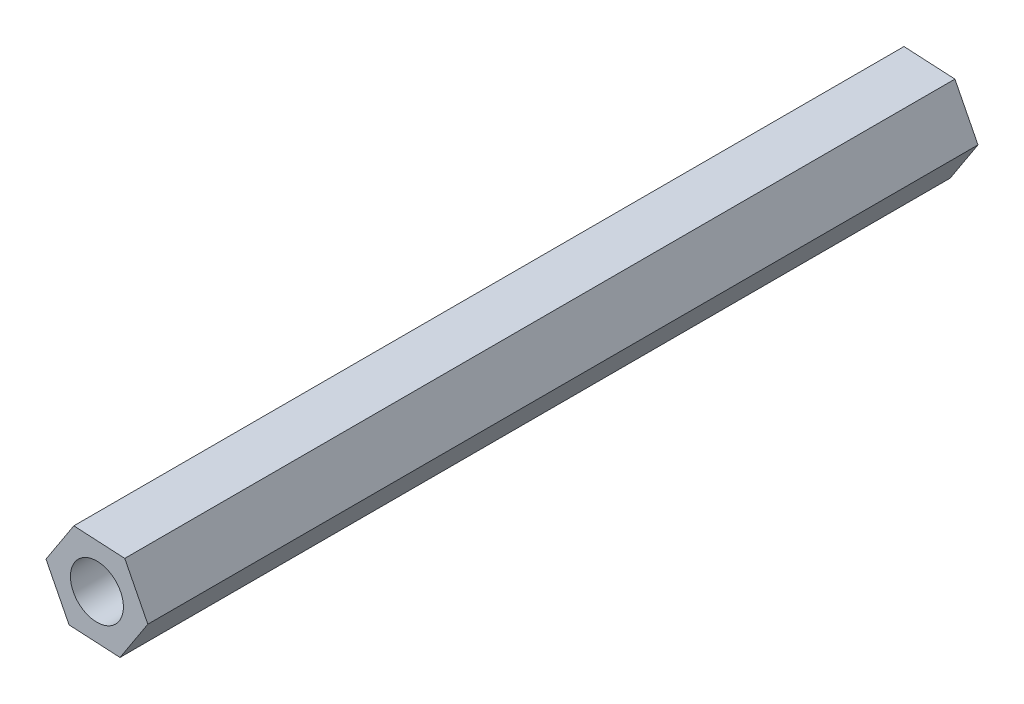
ISO-10303-21;
HEADER;
FILE_DESCRIPTION(('STEP AP214'),'2;1');
FILE_NAME('part.step','',(''),(''),'','','');
FILE_SCHEMA(('AUTOMOTIVE_DESIGN { 1 0 10303 214 1 1 1 1 }'));
ENDSEC;
DATA;
#1=APPLICATION_CONTEXT('core data for automotive mechanical design processes');
#2=APPLICATION_PROTOCOL_DEFINITION('international standard','automotive_design',2000,#1);
#3=PRODUCT_CONTEXT('',#1,'mechanical');
#4=PRODUCT('Part','Part','',(#3));
#5=PRODUCT_RELATED_PRODUCT_CATEGORY('part','',(#4));
#6=PRODUCT_DEFINITION_FORMATION('','',#4);
#7=PRODUCT_DEFINITION_CONTEXT('part definition',#1,'design');
#8=PRODUCT_DEFINITION('design','',#6,#7);
#9=PRODUCT_DEFINITION_SHAPE('','',#8);
#10=(LENGTH_UNIT() NAMED_UNIT(*) SI_UNIT(.MILLI.,.METRE.));
#11=(NAMED_UNIT(*) PLANE_ANGLE_UNIT() SI_UNIT($,.RADIAN.));
#12=(NAMED_UNIT(*) SI_UNIT($,.STERADIAN.) SOLID_ANGLE_UNIT());
#13=UNCERTAINTY_MEASURE_WITH_UNIT(LENGTH_MEASURE(1.E-05),#10,'distance_accuracy_value','');
#14=(GEOMETRIC_REPRESENTATION_CONTEXT(3) GLOBAL_UNCERTAINTY_ASSIGNED_CONTEXT((#13)) GLOBAL_UNIT_ASSIGNED_CONTEXT((#10,
#11,#12)) REPRESENTATION_CONTEXT('',''));
#15=CARTESIAN_POINT('',(0.,0.,0.));
#16=DIRECTION('',(0.,0.,1.));
#17=DIRECTION('',(1.,0.,0.));
#18=AXIS2_PLACEMENT_3D('',#15,#16,#17);
#19=CARTESIAN_POINT('',(2.8825916016709,-0.154916078280261,47.));
#20=DIRECTION('',(-0.891609732350342,-0.452804687672456,0.));
#21=DIRECTION('',(0.452804687672456,-0.891609732350343,0.));
#22=AXIS2_PLACEMENT_3D('',#19,#20,#21);
#23=PLANE('',#22);
#24=DIRECTION('',(-0.452804687672456,0.891609732350342,0.));
#25=VECTOR('',#24,1.);
#26=CARTESIAN_POINT('',(2.8825916016709,-0.154916078280261,0.));
#27=LINE('',#26,#25);
#28=CARTESIAN_POINT('',(2.8825916016709,-0.154916078280261,0.));
#29=VERTEX_POINT('',#28);
#30=CARTESIAN_POINT('',(1.57545706008081,2.41893951664254,0.));
#31=VERTEX_POINT('',#30);
#32=EDGE_CURVE('E116',#29,#31,#27,.T.);
#33=ORIENTED_EDGE('',*,*,#32,.T.);
#34=DIRECTION('',(0.,0.,-1.));
#35=VECTOR('',#34,1.);
#36=CARTESIAN_POINT('',(1.57545706008081,2.41893951664254,47.));
#37=LINE('',#36,#35);
#38=CARTESIAN_POINT('',(1.57545706008081,2.41893951664254,47.));
#39=VERTEX_POINT('',#38);
#40=EDGE_CURVE('E11',#39,#31,#37,.T.);
#41=ORIENTED_EDGE('',*,*,#40,.F.);
#42=DIRECTION('',(-0.452804687672456,0.891609732350342,0.));
#43=VECTOR('',#42,1.);
#44=CARTESIAN_POINT('',(2.8825916016709,-0.154916078280261,47.));
#45=LINE('',#44,#43);
#46=CARTESIAN_POINT('',(2.8825916016709,-0.154916078280261,47.));
#47=VERTEX_POINT('',#46);
#48=EDGE_CURVE('E127',#47,#39,#45,.T.);
#49=ORIENTED_EDGE('',*,*,#48,.F.);
#50=DIRECTION('',(0.,0.,-1.));
#51=VECTOR('',#50,1.);
#52=CARTESIAN_POINT('',(2.8825916016709,-0.154916078280261,47.));
#53=LINE('',#52,#51);
#54=EDGE_CURVE('E112',#47,#29,#53,.T.);
#55=ORIENTED_EDGE('',*,*,#54,.T.);
#56=EDGE_LOOP('',(#33,#41,#49,#55));
#57=FACE_BOUND('',#56,.T.);
#58=ADVANCED_FACE('F32',(#57),#23,.F.);
#59=CARTESIAN_POINT('',(1.57545706008081,2.41893951664254,47.));
#60=DIRECTION('',(-0.0536645036981452,-0.998559022313069,0.));
#61=DIRECTION('',(0.998559022313069,-0.0536645036981452,0.));
#62=AXIS2_PLACEMENT_3D('',#59,#60,#61);
#63=PLANE('',#62);
#64=DIRECTION('',(-0.998559022313069,0.0536645036981452,0.));
#65=VECTOR('',#64,1.);
#66=CARTESIAN_POINT('',(1.57545706008081,2.41893951664254,0.));
#67=LINE('',#66,#65);
#68=CARTESIAN_POINT('',(-1.30713454159008,2.5738555949228,0.));
#69=VERTEX_POINT('',#68);
#70=EDGE_CURVE('E119',#31,#69,#67,.T.);
#71=ORIENTED_EDGE('',*,*,#70,.T.);
#72=DIRECTION('',(0.,0.,-1.));
#73=VECTOR('',#72,1.);
#74=CARTESIAN_POINT('',(-1.30713454159008,2.5738555949228,47.));
#75=LINE('',#74,#73);
#76=CARTESIAN_POINT('',(-1.30713454159008,2.5738555949228,47.));
#77=VERTEX_POINT('',#76);
#78=EDGE_CURVE('E40',#77,#69,#75,.T.);
#79=ORIENTED_EDGE('',*,*,#78,.F.);
#80=DIRECTION('',(-0.998559022313069,0.0536645036981452,0.));
#81=VECTOR('',#80,1.);
#82=CARTESIAN_POINT('',(1.57545706008081,2.41893951664254,47.));
#83=LINE('',#82,#81);
#84=EDGE_CURVE('E85',#39,#77,#83,.T.);
#85=ORIENTED_EDGE('',*,*,#84,.F.);
#86=ORIENTED_EDGE('',*,*,#40,.T.);
#87=EDGE_LOOP('',(#71,#79,#85,#86));
#88=FACE_BOUND('',#87,.T.);
#89=ADVANCED_FACE('F152',(#88),#63,.F.);
#90=CARTESIAN_POINT('',(-1.30713454159008,2.5738555949228,47.));
#91=DIRECTION('',(0.837945228652197,-0.545754334640612,0.));
#92=DIRECTION('',(0.545754334640612,0.837945228652197,0.));
#93=AXIS2_PLACEMENT_3D('',#90,#91,#92);
#94=PLANE('',#93);
#95=DIRECTION('',(-0.545754334640612,-0.837945228652197,0.));
#96=VECTOR('',#95,1.);
#97=CARTESIAN_POINT('',(-1.30713454159008,2.5738555949228,0.));
#98=LINE('',#97,#96);
#99=CARTESIAN_POINT('',(-2.88259160167089,0.154916078280261,0.));
#100=VERTEX_POINT('',#99);
#101=EDGE_CURVE('E122',#69,#100,#98,.T.);
#102=ORIENTED_EDGE('',*,*,#101,.T.);
#103=DIRECTION('',(0.,0.,-1.));
#104=VECTOR('',#103,1.);
#105=CARTESIAN_POINT('',(-2.88259160167089,0.154916078280261,47.));
#106=LINE('',#105,#104);
#107=CARTESIAN_POINT('',(-2.88259160167089,0.154916078280261,47.));
#108=VERTEX_POINT('',#107);
#109=EDGE_CURVE('E107',#108,#100,#106,.T.);
#110=ORIENTED_EDGE('',*,*,#109,.F.);
#111=DIRECTION('',(-0.545754334640612,-0.837945228652197,0.));
#112=VECTOR('',#111,1.);
#113=CARTESIAN_POINT('',(-1.30713454159008,2.5738555949228,47.));
#114=LINE('',#113,#112);
#115=EDGE_CURVE('E98',#77,#108,#114,.T.);
#116=ORIENTED_EDGE('',*,*,#115,.F.);
#117=ORIENTED_EDGE('',*,*,#78,.T.);
#118=EDGE_LOOP('',(#102,#110,#116,#117));
#119=FACE_BOUND('',#118,.T.);
#120=ADVANCED_FACE('F133',(#119),#94,.F.);
#121=CARTESIAN_POINT('',(-2.88259160167089,0.154916078280261,47.));
#122=DIRECTION('',(0.891609732350342,0.452804687672456,0.));
#123=DIRECTION('',(-0.452804687672456,0.891609732350343,0.));
#124=AXIS2_PLACEMENT_3D('',#121,#122,#123);
#125=PLANE('',#124);
#126=DIRECTION('',(0.452804687672456,-0.891609732350343,0.));
#127=VECTOR('',#126,1.);
#128=CARTESIAN_POINT('',(-2.88259160167089,0.154916078280261,0.));
#129=LINE('',#128,#127);
#130=CARTESIAN_POINT('',(-1.57545706008081,-2.41893951664254,0.));
#131=VERTEX_POINT('',#130);
#132=EDGE_CURVE('E106',#100,#131,#129,.T.);
#133=ORIENTED_EDGE('',*,*,#132,.T.);
#134=DIRECTION('',(0.,0.,-1.));
#135=VECTOR('',#134,1.);
#136=CARTESIAN_POINT('',(-1.57545706008081,-2.41893951664254,47.));
#137=LINE('',#136,#135);
#138=CARTESIAN_POINT('',(-1.57545706008081,-2.41893951664254,47.));
#139=VERTEX_POINT('',#138);
#140=EDGE_CURVE('E103',#139,#131,#137,.T.);
#141=ORIENTED_EDGE('',*,*,#140,.F.);
#142=DIRECTION('',(0.452804687672456,-0.891609732350343,0.));
#143=VECTOR('',#142,1.);
#144=CARTESIAN_POINT('',(-2.88259160167089,0.154916078280261,47.));
#145=LINE('',#144,#143);
#146=EDGE_CURVE('E92',#108,#139,#145,.T.);
#147=ORIENTED_EDGE('',*,*,#146,.F.);
#148=ORIENTED_EDGE('',*,*,#109,.T.);
#149=EDGE_LOOP('',(#133,#141,#147,#148));
#150=FACE_BOUND('',#149,.T.);
#151=ADVANCED_FACE('F104',(#150),#125,.F.);
#152=CARTESIAN_POINT('',(-1.57545706008081,-2.41893951664254,47.));
#153=DIRECTION('',(0.0536645036981452,0.998559022313069,0.));
#154=DIRECTION('',(-0.998559022313069,0.0536645036981452,0.));
#155=AXIS2_PLACEMENT_3D('',#152,#153,#154);
#156=PLANE('',#155);
#157=DIRECTION('',(0.998559022313069,-0.0536645036981452,0.));
#158=VECTOR('',#157,1.);
#159=CARTESIAN_POINT('',(-1.57545706008081,-2.41893951664254,0.));
#160=LINE('',#159,#158);
#161=CARTESIAN_POINT('',(1.30713454159009,-2.5738555949228,0.));
#162=VERTEX_POINT('',#161);
#163=EDGE_CURVE('E71',#131,#162,#160,.T.);
#164=ORIENTED_EDGE('',*,*,#163,.T.);
#165=DIRECTION('',(0.,0.,-1.));
#166=VECTOR('',#165,1.);
#167=CARTESIAN_POINT('',(1.30713454159009,-2.5738555949228,47.));
#168=LINE('',#167,#166);
#169=CARTESIAN_POINT('',(1.30713454159009,-2.5738555949228,47.));
#170=VERTEX_POINT('',#169);
#171=EDGE_CURVE('E108',#170,#162,#168,.T.);
#172=ORIENTED_EDGE('',*,*,#171,.F.);
#173=DIRECTION('',(0.998559022313069,-0.0536645036981452,0.));
#174=VECTOR('',#173,1.);
#175=CARTESIAN_POINT('',(-1.57545706008081,-2.41893951664254,47.));
#176=LINE('',#175,#174);
#177=EDGE_CURVE('E96',#139,#170,#176,.T.);
#178=ORIENTED_EDGE('',*,*,#177,.F.);
#179=ORIENTED_EDGE('',*,*,#140,.T.);
#180=EDGE_LOOP('',(#164,#172,#178,#179));
#181=FACE_BOUND('',#180,.T.);
#182=ADVANCED_FACE('F110',(#181),#156,.F.);
#183=CARTESIAN_POINT('',(1.30713454159009,-2.5738555949228,47.));
#184=DIRECTION('',(-0.837945228652197,0.545754334640612,0.));
#185=DIRECTION('',(-0.545754334640612,-0.837945228652197,0.));
#186=AXIS2_PLACEMENT_3D('',#183,#184,#185);
#187=PLANE('',#186);
#188=DIRECTION('',(0.545754334640612,0.837945228652197,0.));
#189=VECTOR('',#188,1.);
#190=CARTESIAN_POINT('',(1.30713454159009,-2.5738555949228,0.));
#191=LINE('',#190,#189);
#192=EDGE_CURVE('E77',#162,#29,#191,.T.);
#193=ORIENTED_EDGE('',*,*,#192,.T.);
#194=ORIENTED_EDGE('',*,*,#54,.F.);
#195=DIRECTION('',(0.545754334640612,0.837945228652197,0.));
#196=VECTOR('',#195,1.);
#197=CARTESIAN_POINT('',(1.30713454159009,-2.5738555949228,47.));
#198=LINE('',#197,#196);
#199=EDGE_CURVE('E48',#170,#47,#198,.T.);
#200=ORIENTED_EDGE('',*,*,#199,.F.);
#201=ORIENTED_EDGE('',*,*,#171,.T.);
#202=EDGE_LOOP('',(#193,#194,#200,#201));
#203=FACE_BOUND('',#202,.T.);
#204=ADVANCED_FACE('F140',(#203),#187,.F.);
#205=CARTESIAN_POINT('',(1.57545706008081,2.41893951664254,47.));
#206=DIRECTION('',(0.,0.,1.));
#207=DIRECTION('',(1.,0.,0.));
#208=AXIS2_PLACEMENT_3D('',#205,#206,#207);
#209=PLANE('',#208);
#210=CARTESIAN_POINT('',(0.,0.,47.));
#211=DIRECTION('',(0.,0.,-1.));
#212=DIRECTION('',(-1.,0.,0.));
#213=AXIS2_PLACEMENT_3D('',#210,#211,#212);
#214=CIRCLE('',#213,1.5);
#215=CARTESIAN_POINT('',(-1.5,0.,47.));
#216=VERTEX_POINT('',#215);
#217=EDGE_CURVE('E120',#216,#216,#214,.T.);
#218=ORIENTED_EDGE('',*,*,#217,.T.);
#219=EDGE_LOOP('',(#218));
#220=FACE_BOUND('',#219,.T.);
#221=ORIENTED_EDGE('',*,*,#48,.T.);
#222=ORIENTED_EDGE('',*,*,#84,.T.);
#223=ORIENTED_EDGE('',*,*,#115,.T.);
#224=ORIENTED_EDGE('',*,*,#146,.T.);
#225=ORIENTED_EDGE('',*,*,#177,.T.);
#226=ORIENTED_EDGE('',*,*,#199,.T.);
#227=EDGE_LOOP('',(#221,#222,#223,#224,#225,#226));
#228=FACE_BOUND('',#227,.T.);
#229=ADVANCED_FACE('F94',(#220,#228),#209,.T.);
#230=CARTESIAN_POINT('',(1.57545706008081,2.41893951664254,0.));
#231=DIRECTION('',(0.,0.,1.));
#232=DIRECTION('',(1.,0.,0.));
#233=AXIS2_PLACEMENT_3D('',#230,#231,#232);
#234=PLANE('',#233);
#235=CARTESIAN_POINT('',(0.,0.,0.));
#236=DIRECTION('',(0.,0.,-1.));
#237=DIRECTION('',(-1.,0.,0.));
#238=AXIS2_PLACEMENT_3D('',#235,#236,#237);
#239=CIRCLE('',#238,1.5);
#240=CARTESIAN_POINT('',(-1.5,0.,0.));
#241=VERTEX_POINT('',#240);
#242=EDGE_CURVE('E207',#241,#241,#239,.T.);
#243=ORIENTED_EDGE('',*,*,#242,.F.);
#244=EDGE_LOOP('',(#243));
#245=FACE_BOUND('',#244,.T.);
#246=ORIENTED_EDGE('',*,*,#32,.F.);
#247=ORIENTED_EDGE('',*,*,#192,.F.);
#248=ORIENTED_EDGE('',*,*,#163,.F.);
#249=ORIENTED_EDGE('',*,*,#132,.F.);
#250=ORIENTED_EDGE('',*,*,#101,.F.);
#251=ORIENTED_EDGE('',*,*,#70,.F.);
#252=EDGE_LOOP('',(#246,#247,#248,#249,#250,#251));
#253=FACE_BOUND('',#252,.T.);
#254=ADVANCED_FACE('F136',(#245,#253),#234,.F.);
#255=CARTESIAN_POINT('',(0.,0.,47.));
#256=DIRECTION('',(0.,0.,-1.));
#257=DIRECTION('',(-1.,0.,0.));
#258=AXIS2_PLACEMENT_3D('',#255,#256,#257);
#259=CYLINDRICAL_SURFACE('',#258,1.5);
#260=ORIENTED_EDGE('',*,*,#217,.F.);
#261=EDGE_LOOP('',(#260));
#262=FACE_BOUND('',#261,.T.);
#263=ORIENTED_EDGE('',*,*,#242,.T.);
#264=EDGE_LOOP('',(#263));
#265=FACE_BOUND('',#264,.T.);
#266=ADVANCED_FACE('F189',(#262,#265),#259,.F.);
#267=CLOSED_SHELL('',(#58,#89,#120,#151,#182,#204,#229,#254,#266));
#268=MANIFOLD_SOLID_BREP('B2',#267);
#269=ADVANCED_BREP_SHAPE_REPRESENTATION('',(#18,#268),#14);
#270=SHAPE_DEFINITION_REPRESENTATION(#9,#269);
ENDSEC;
END-ISO-10303-21;
